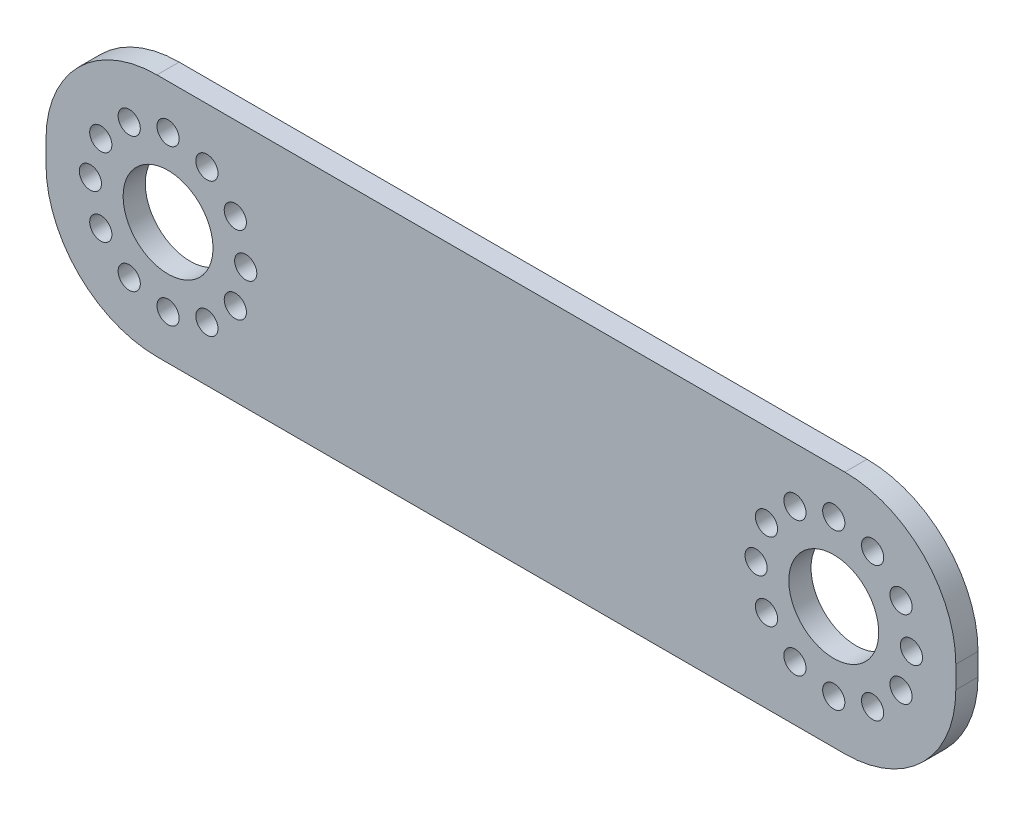
ISO-10303-21;
HEADER;
FILE_DESCRIPTION(('STEP AP214'),'2;1');
FILE_NAME('part.step','',(''),(''),'','','');
FILE_SCHEMA(('AUTOMOTIVE_DESIGN { 1 0 10303 214 1 1 1 1 }'));
ENDSEC;
DATA;
#1=APPLICATION_CONTEXT('core data for automotive mechanical design processes');
#2=APPLICATION_PROTOCOL_DEFINITION('international standard','automotive_design',2000,#1);
#3=PRODUCT_CONTEXT('',#1,'mechanical');
#4=PRODUCT('Part','Part','',(#3));
#5=PRODUCT_RELATED_PRODUCT_CATEGORY('part','',(#4));
#6=PRODUCT_DEFINITION_FORMATION('','',#4);
#7=PRODUCT_DEFINITION_CONTEXT('part definition',#1,'design');
#8=PRODUCT_DEFINITION('design','',#6,#7);
#9=PRODUCT_DEFINITION_SHAPE('','',#8);
#10=(LENGTH_UNIT() NAMED_UNIT(*) SI_UNIT(.MILLI.,.METRE.));
#11=(NAMED_UNIT(*) PLANE_ANGLE_UNIT() SI_UNIT($,.RADIAN.));
#12=(NAMED_UNIT(*) SI_UNIT($,.STERADIAN.) SOLID_ANGLE_UNIT());
#13=UNCERTAINTY_MEASURE_WITH_UNIT(LENGTH_MEASURE(1.E-05),#10,'distance_accuracy_value','');
#14=(GEOMETRIC_REPRESENTATION_CONTEXT(3) GLOBAL_UNCERTAINTY_ASSIGNED_CONTEXT((#13)) GLOBAL_UNIT_ASSIGNED_CONTEXT((#10,
#11,#12)) REPRESENTATION_CONTEXT('',''));
#15=CARTESIAN_POINT('',(0.,0.,0.));
#16=DIRECTION('',(0.,0.,1.));
#17=DIRECTION('',(1.,0.,0.));
#18=AXIS2_PLACEMENT_3D('',#15,#16,#17);
#19=CARTESIAN_POINT('',(82.,11.,2.));
#20=DIRECTION('',(1.,0.,0.));
#21=DIRECTION('',(0.,0.,-1.));
#22=AXIS2_PLACEMENT_3D('',#19,#20,#21);
#23=PLANE('',#22);
#24=DIRECTION('',(0.,-1.,0.));
#25=VECTOR('',#24,1.);
#26=CARTESIAN_POINT('',(82.,11.,0.));
#27=LINE('',#26,#25);
#28=CARTESIAN_POINT('',(82.,0.999999999999999,0.));
#29=VERTEX_POINT('',#28);
#30=CARTESIAN_POINT('',(82.,-0.999999999999999,0.));
#31=VERTEX_POINT('',#30);
#32=EDGE_CURVE('E160',#29,#31,#27,.T.);
#33=ORIENTED_EDGE('',*,*,#32,.F.);
#34=DIRECTION('',(0.,0.,-1.));
#35=VECTOR('',#34,1.);
#36=CARTESIAN_POINT('',(82.,0.999999999999999,2.));
#37=LINE('',#36,#35);
#38=CARTESIAN_POINT('',(82.,0.999999999999999,2.));
#39=VERTEX_POINT('',#38);
#40=EDGE_CURVE('E140',#29,#39,#37,.F.);
#41=ORIENTED_EDGE('',*,*,#40,.T.);
#42=DIRECTION('',(0.,-1.,0.));
#43=VECTOR('',#42,1.);
#44=CARTESIAN_POINT('',(82.,11.,2.));
#45=LINE('',#44,#43);
#46=CARTESIAN_POINT('',(82.,-0.999999999999999,2.));
#47=VERTEX_POINT('',#46);
#48=EDGE_CURVE('E121',#39,#47,#45,.T.);
#49=ORIENTED_EDGE('',*,*,#48,.T.);
#50=DIRECTION('',(0.,0.,-1.));
#51=VECTOR('',#50,1.);
#52=CARTESIAN_POINT('',(82.,-0.999999999999999,2.));
#53=LINE('',#52,#51);
#54=EDGE_CURVE('E137',#47,#31,#53,.T.);
#55=ORIENTED_EDGE('',*,*,#54,.T.);
#56=EDGE_LOOP('',(#33,#41,#49,#55));
#57=FACE_BOUND('',#56,.T.);
#58=ADVANCED_FACE('F35',(#57),#23,.T.);
#59=CARTESIAN_POINT('',(0.,11.,2.));
#60=DIRECTION('',(0.,1.,0.));
#61=DIRECTION('',(-1.,0.,0.));
#62=AXIS2_PLACEMENT_3D('',#59,#60,#61);
#63=PLANE('',#62);
#64=DIRECTION('',(1.,0.,0.));
#65=VECTOR('',#64,1.);
#66=CARTESIAN_POINT('',(0.,11.,2.));
#67=LINE('',#66,#65);
#68=CARTESIAN_POINT('',(10.,11.,2.));
#69=VERTEX_POINT('',#68);
#70=CARTESIAN_POINT('',(72.,11.,2.));
#71=VERTEX_POINT('',#70);
#72=EDGE_CURVE('E125',#69,#71,#67,.T.);
#73=ORIENTED_EDGE('',*,*,#72,.T.);
#74=DIRECTION('',(0.,0.,-1.));
#75=VECTOR('',#74,1.);
#76=CARTESIAN_POINT('',(72.,11.,2.));
#77=LINE('',#76,#75);
#78=CARTESIAN_POINT('',(72.,11.,0.));
#79=VERTEX_POINT('',#78);
#80=EDGE_CURVE('E112',#71,#79,#77,.T.);
#81=ORIENTED_EDGE('',*,*,#80,.T.);
#82=DIRECTION('',(1.,0.,0.));
#83=VECTOR('',#82,1.);
#84=CARTESIAN_POINT('',(0.,11.,0.));
#85=LINE('',#84,#83);
#86=CARTESIAN_POINT('',(10.,11.,0.));
#87=VERTEX_POINT('',#86);
#88=EDGE_CURVE('E104',#87,#79,#85,.T.);
#89=ORIENTED_EDGE('',*,*,#88,.F.);
#90=DIRECTION('',(0.,0.,-1.));
#91=VECTOR('',#90,1.);
#92=CARTESIAN_POINT('',(10.,11.,2.));
#93=LINE('',#92,#91);
#94=EDGE_CURVE('E118',#87,#69,#93,.F.);
#95=ORIENTED_EDGE('',*,*,#94,.T.);
#96=EDGE_LOOP('',(#73,#81,#89,#95));
#97=FACE_BOUND('',#96,.T.);
#98=ADVANCED_FACE('F117',(#97),#63,.T.);
#99=CARTESIAN_POINT('',(0.,-11.,2.));
#100=DIRECTION('',(-1.,0.,0.));
#101=DIRECTION('',(0.,-1.,0.));
#102=AXIS2_PLACEMENT_3D('',#99,#100,#101);
#103=PLANE('',#102);
#104=DIRECTION('',(0.,1.,0.));
#105=VECTOR('',#104,1.);
#106=CARTESIAN_POINT('',(0.,-11.,0.));
#107=LINE('',#106,#105);
#108=CARTESIAN_POINT('',(0.,-0.999999999999996,0.));
#109=VERTEX_POINT('',#108);
#110=CARTESIAN_POINT('',(0.,1.,0.));
#111=VERTEX_POINT('',#110);
#112=EDGE_CURVE('E106',#109,#111,#107,.T.);
#113=ORIENTED_EDGE('',*,*,#112,.F.);
#114=DIRECTION('',(0.,0.,-1.));
#115=VECTOR('',#114,1.);
#116=CARTESIAN_POINT('',(0.,-0.999999999999996,2.));
#117=LINE('',#116,#115);
#118=CARTESIAN_POINT('',(0.,-0.999999999999996,2.));
#119=VERTEX_POINT('',#118);
#120=EDGE_CURVE('E11',#109,#119,#117,.F.);
#121=ORIENTED_EDGE('',*,*,#120,.T.);
#122=DIRECTION('',(0.,1.,0.));
#123=VECTOR('',#122,1.);
#124=CARTESIAN_POINT('',(0.,-11.,2.));
#125=LINE('',#124,#123);
#126=CARTESIAN_POINT('',(0.,1.,2.));
#127=VERTEX_POINT('',#126);
#128=EDGE_CURVE('E128',#119,#127,#125,.T.);
#129=ORIENTED_EDGE('',*,*,#128,.T.);
#130=DIRECTION('',(0.,0.,-1.));
#131=VECTOR('',#130,1.);
#132=CARTESIAN_POINT('',(0.,1.,2.));
#133=LINE('',#132,#131);
#134=EDGE_CURVE('E43',#127,#111,#133,.T.);
#135=ORIENTED_EDGE('',*,*,#134,.T.);
#136=EDGE_LOOP('',(#113,#121,#129,#135));
#137=FACE_BOUND('',#136,.T.);
#138=ADVANCED_FACE('F153',(#137),#103,.T.);
#139=CARTESIAN_POINT('',(82.,-11.,2.));
#140=DIRECTION('',(0.,-1.,0.));
#141=DIRECTION('',(1.,0.,0.));
#142=AXIS2_PLACEMENT_3D('',#139,#140,#141);
#143=PLANE('',#142);
#144=DIRECTION('',(-1.,0.,0.));
#145=VECTOR('',#144,1.);
#146=CARTESIAN_POINT('',(82.,-11.,0.));
#147=LINE('',#146,#145);
#148=CARTESIAN_POINT('',(72.,-11.,0.));
#149=VERTEX_POINT('',#148);
#150=CARTESIAN_POINT('',(9.99999999999999,-11.,0.));
#151=VERTEX_POINT('',#150);
#152=EDGE_CURVE('E163',#149,#151,#147,.T.);
#153=ORIENTED_EDGE('',*,*,#152,.F.);
#154=DIRECTION('',(0.,0.,-1.));
#155=VECTOR('',#154,1.);
#156=CARTESIAN_POINT('',(72.,-11.,2.));
#157=LINE('',#156,#155);
#158=CARTESIAN_POINT('',(72.,-11.,2.));
#159=VERTEX_POINT('',#158);
#160=EDGE_CURVE('E57',#149,#159,#157,.F.);
#161=ORIENTED_EDGE('',*,*,#160,.T.);
#162=DIRECTION('',(-1.,0.,0.));
#163=VECTOR('',#162,1.);
#164=CARTESIAN_POINT('',(82.,-11.,2.));
#165=LINE('',#164,#163);
#166=CARTESIAN_POINT('',(9.99999999999999,-11.,2.));
#167=VERTEX_POINT('',#166);
#168=EDGE_CURVE('E155',#159,#167,#165,.T.);
#169=ORIENTED_EDGE('',*,*,#168,.T.);
#170=DIRECTION('',(0.,0.,-1.));
#171=VECTOR('',#170,1.);
#172=CARTESIAN_POINT('',(9.99999999999999,-11.,2.));
#173=LINE('',#172,#171);
#174=EDGE_CURVE('E148',#167,#151,#173,.T.);
#175=ORIENTED_EDGE('',*,*,#174,.T.);
#176=EDGE_LOOP('',(#153,#161,#169,#175));
#177=FACE_BOUND('',#176,.T.);
#178=ADVANCED_FACE('F166',(#177),#143,.T.);
#179=CARTESIAN_POINT('',(0.,0.,2.));
#180=DIRECTION('',(0.,0.,-1.));
#181=DIRECTION('',(-1.,0.,0.));
#182=AXIS2_PLACEMENT_3D('',#179,#180,#181);
#183=PLANE('',#182);
#184=CARTESIAN_POINT('',(64.9378221735089,3.5,2.));
#185=DIRECTION('',(0.,0.,-1.));
#186=DIRECTION('',(-1.,0.,0.));
#187=AXIS2_PLACEMENT_3D('',#184,#185,#186);
#188=CIRCLE('',#187,0.999999999999998);
#189=CARTESIAN_POINT('',(63.9378221735089,3.5,2.));
#190=VERTEX_POINT('',#189);
#191=EDGE_CURVE('E327',#190,#190,#188,.T.);
#192=ORIENTED_EDGE('',*,*,#191,.T.);
#193=EDGE_LOOP('',(#192));
#194=FACE_BOUND('',#193,.T.);
#195=CARTESIAN_POINT('',(67.5,6.06217782649107,2.));
#196=DIRECTION('',(0.,0.,-1.));
#197=DIRECTION('',(-1.,0.,0.));
#198=AXIS2_PLACEMENT_3D('',#195,#196,#197);
#199=CIRCLE('',#198,1.00000000000001);
#200=CARTESIAN_POINT('',(66.5,6.06217782649107,2.));
#201=VERTEX_POINT('',#200);
#202=EDGE_CURVE('E321',#201,#201,#199,.T.);
#203=ORIENTED_EDGE('',*,*,#202,.T.);
#204=EDGE_LOOP('',(#203));
#205=FACE_BOUND('',#204,.T.);
#206=CARTESIAN_POINT('',(71.,7.,2.));
#207=DIRECTION('',(0.,0.,-1.));
#208=DIRECTION('',(-1.,0.,0.));
#209=AXIS2_PLACEMENT_3D('',#206,#207,#208);
#210=CIRCLE('',#209,0.999999999999998);
#211=CARTESIAN_POINT('',(70.,7.,2.));
#212=VERTEX_POINT('',#211);
#213=EDGE_CURVE('E315',#212,#212,#210,.T.);
#214=ORIENTED_EDGE('',*,*,#213,.T.);
#215=EDGE_LOOP('',(#214));
#216=FACE_BOUND('',#215,.T.);
#217=CARTESIAN_POINT('',(74.5,6.06217782649107,2.));
#218=DIRECTION('',(0.,0.,-1.));
#219=DIRECTION('',(-1.,0.,0.));
#220=AXIS2_PLACEMENT_3D('',#217,#218,#219);
#221=CIRCLE('',#220,0.999999999999998);
#222=CARTESIAN_POINT('',(73.5,6.06217782649107,2.));
#223=VERTEX_POINT('',#222);
#224=EDGE_CURVE('E309',#223,#223,#221,.T.);
#225=ORIENTED_EDGE('',*,*,#224,.T.);
#226=EDGE_LOOP('',(#225));
#227=FACE_BOUND('',#226,.T.);
#228=CARTESIAN_POINT('',(77.0621778264911,3.5,2.));
#229=DIRECTION('',(0.,0.,-1.));
#230=DIRECTION('',(-1.,0.,0.));
#231=AXIS2_PLACEMENT_3D('',#228,#229,#230);
#232=CIRCLE('',#231,0.999999999999998);
#233=CARTESIAN_POINT('',(76.0621778264911,3.5,2.));
#234=VERTEX_POINT('',#233);
#235=EDGE_CURVE('E303',#234,#234,#232,.T.);
#236=ORIENTED_EDGE('',*,*,#235,.T.);
#237=EDGE_LOOP('',(#236));
#238=FACE_BOUND('',#237,.T.);
#239=CARTESIAN_POINT('',(78.,0.,2.));
#240=DIRECTION('',(0.,0.,-1.));
#241=DIRECTION('',(-1.,0.,0.));
#242=AXIS2_PLACEMENT_3D('',#239,#240,#241);
#243=CIRCLE('',#242,1.00000000000001);
#244=CARTESIAN_POINT('',(77.,0.,2.));
#245=VERTEX_POINT('',#244);
#246=EDGE_CURVE('E297',#245,#245,#243,.T.);
#247=ORIENTED_EDGE('',*,*,#246,.T.);
#248=EDGE_LOOP('',(#247));
#249=FACE_BOUND('',#248,.T.);
#250=CARTESIAN_POINT('',(77.0621778264911,-3.5,2.));
#251=DIRECTION('',(0.,0.,-1.));
#252=DIRECTION('',(-1.,0.,0.));
#253=AXIS2_PLACEMENT_3D('',#250,#251,#252);
#254=CIRCLE('',#253,0.999999999999998);
#255=CARTESIAN_POINT('',(76.0621778264911,-3.5,2.));
#256=VERTEX_POINT('',#255);
#257=EDGE_CURVE('E291',#256,#256,#254,.T.);
#258=ORIENTED_EDGE('',*,*,#257,.T.);
#259=EDGE_LOOP('',(#258));
#260=FACE_BOUND('',#259,.T.);
#261=CARTESIAN_POINT('',(74.5,-6.06217782649107,2.));
#262=DIRECTION('',(0.,0.,-1.));
#263=DIRECTION('',(-1.,0.,0.));
#264=AXIS2_PLACEMENT_3D('',#261,#262,#263);
#265=CIRCLE('',#264,1.00000000000001);
#266=CARTESIAN_POINT('',(73.5,-6.06217782649107,2.));
#267=VERTEX_POINT('',#266);
#268=EDGE_CURVE('E285',#267,#267,#265,.T.);
#269=ORIENTED_EDGE('',*,*,#268,.T.);
#270=EDGE_LOOP('',(#269));
#271=FACE_BOUND('',#270,.T.);
#272=CARTESIAN_POINT('',(71.,-7.,2.));
#273=DIRECTION('',(0.,0.,-1.));
#274=DIRECTION('',(-1.,0.,0.));
#275=AXIS2_PLACEMENT_3D('',#272,#273,#274);
#276=CIRCLE('',#275,0.999999999999998);
#277=CARTESIAN_POINT('',(70.,-7.,2.));
#278=VERTEX_POINT('',#277);
#279=EDGE_CURVE('E279',#278,#278,#276,.T.);
#280=ORIENTED_EDGE('',*,*,#279,.T.);
#281=EDGE_LOOP('',(#280));
#282=FACE_BOUND('',#281,.T.);
#283=CARTESIAN_POINT('',(67.5,-6.06217782649107,2.));
#284=DIRECTION('',(0.,0.,-1.));
#285=DIRECTION('',(-1.,0.,0.));
#286=AXIS2_PLACEMENT_3D('',#283,#284,#285);
#287=CIRCLE('',#286,0.999999999999998);
#288=CARTESIAN_POINT('',(66.5,-6.06217782649107,2.));
#289=VERTEX_POINT('',#288);
#290=EDGE_CURVE('E273',#289,#289,#287,.T.);
#291=ORIENTED_EDGE('',*,*,#290,.T.);
#292=EDGE_LOOP('',(#291));
#293=FACE_BOUND('',#292,.T.);
#294=CARTESIAN_POINT('',(64.9378221735089,-3.5,2.));
#295=DIRECTION('',(0.,0.,-1.));
#296=DIRECTION('',(-1.,0.,0.));
#297=AXIS2_PLACEMENT_3D('',#294,#295,#296);
#298=CIRCLE('',#297,0.999999999999998);
#299=CARTESIAN_POINT('',(63.9378221735089,-3.5,2.));
#300=VERTEX_POINT('',#299);
#301=EDGE_CURVE('E267',#300,#300,#298,.T.);
#302=ORIENTED_EDGE('',*,*,#301,.T.);
#303=EDGE_LOOP('',(#302));
#304=FACE_BOUND('',#303,.T.);
#305=CARTESIAN_POINT('',(64.,0.,2.));
#306=DIRECTION('',(0.,0.,-1.));
#307=DIRECTION('',(-1.,0.,0.));
#308=AXIS2_PLACEMENT_3D('',#305,#306,#307);
#309=CIRCLE('',#308,0.999999999999998);
#310=CARTESIAN_POINT('',(63.,0.,2.));
#311=VERTEX_POINT('',#310);
#312=EDGE_CURVE('E261',#311,#311,#309,.T.);
#313=ORIENTED_EDGE('',*,*,#312,.T.);
#314=EDGE_LOOP('',(#313));
#315=FACE_BOUND('',#314,.T.);
#316=CARTESIAN_POINT('',(71.,0.,2.));
#317=DIRECTION('',(0.,0.,-1.));
#318=DIRECTION('',(-1.,0.,0.));
#319=AXIS2_PLACEMENT_3D('',#316,#317,#318);
#320=CIRCLE('',#319,4.05);
#321=CARTESIAN_POINT('',(66.95,0.,2.));
#322=VERTEX_POINT('',#321);
#323=EDGE_CURVE('E255',#322,#322,#320,.T.);
#324=ORIENTED_EDGE('',*,*,#323,.T.);
#325=EDGE_LOOP('',(#324));
#326=FACE_BOUND('',#325,.T.);
#327=CARTESIAN_POINT('',(4.93782217350893,3.5,2.));
#328=DIRECTION('',(0.,0.,-1.));
#329=DIRECTION('',(-1.,0.,0.));
#330=AXIS2_PLACEMENT_3D('',#327,#328,#329);
#331=CIRCLE('',#330,1.);
#332=CARTESIAN_POINT('',(3.93782217350893,3.5,2.));
#333=VERTEX_POINT('',#332);
#334=EDGE_CURVE('E249',#333,#333,#331,.T.);
#335=ORIENTED_EDGE('',*,*,#334,.T.);
#336=EDGE_LOOP('',(#335));
#337=FACE_BOUND('',#336,.T.);
#338=CARTESIAN_POINT('',(7.5,6.06217782649107,2.));
#339=DIRECTION('',(0.,0.,-1.));
#340=DIRECTION('',(-1.,0.,0.));
#341=AXIS2_PLACEMENT_3D('',#338,#339,#340);
#342=CIRCLE('',#341,1.);
#343=CARTESIAN_POINT('',(6.5,6.06217782649107,2.));
#344=VERTEX_POINT('',#343);
#345=EDGE_CURVE('E243',#344,#344,#342,.T.);
#346=ORIENTED_EDGE('',*,*,#345,.T.);
#347=EDGE_LOOP('',(#346));
#348=FACE_BOUND('',#347,.T.);
#349=CARTESIAN_POINT('',(11.,7.,2.));
#350=DIRECTION('',(0.,0.,-1.));
#351=DIRECTION('',(-1.,0.,0.));
#352=AXIS2_PLACEMENT_3D('',#349,#350,#351);
#353=CIRCLE('',#352,1.);
#354=CARTESIAN_POINT('',(10.,7.,2.));
#355=VERTEX_POINT('',#354);
#356=EDGE_CURVE('E237',#355,#355,#353,.T.);
#357=ORIENTED_EDGE('',*,*,#356,.T.);
#358=EDGE_LOOP('',(#357));
#359=FACE_BOUND('',#358,.T.);
#360=CARTESIAN_POINT('',(14.5,6.06217782649107,2.));
#361=DIRECTION('',(0.,0.,-1.));
#362=DIRECTION('',(-1.,0.,0.));
#363=AXIS2_PLACEMENT_3D('',#360,#361,#362);
#364=CIRCLE('',#363,1.);
#365=CARTESIAN_POINT('',(13.5,6.06217782649107,2.));
#366=VERTEX_POINT('',#365);
#367=EDGE_CURVE('E231',#366,#366,#364,.T.);
#368=ORIENTED_EDGE('',*,*,#367,.T.);
#369=EDGE_LOOP('',(#368));
#370=FACE_BOUND('',#369,.T.);
#371=CARTESIAN_POINT('',(17.0621778264911,3.5,2.));
#372=DIRECTION('',(0.,0.,-1.));
#373=DIRECTION('',(-1.,0.,0.));
#374=AXIS2_PLACEMENT_3D('',#371,#372,#373);
#375=CIRCLE('',#374,1.);
#376=CARTESIAN_POINT('',(16.0621778264911,3.5,2.));
#377=VERTEX_POINT('',#376);
#378=EDGE_CURVE('E225',#377,#377,#375,.T.);
#379=ORIENTED_EDGE('',*,*,#378,.T.);
#380=EDGE_LOOP('',(#379));
#381=FACE_BOUND('',#380,.T.);
#382=CARTESIAN_POINT('',(18.,0.,2.));
#383=DIRECTION('',(0.,0.,-1.));
#384=DIRECTION('',(-1.,0.,0.));
#385=AXIS2_PLACEMENT_3D('',#382,#383,#384);
#386=CIRCLE('',#385,0.999999999999998);
#387=CARTESIAN_POINT('',(17.,0.,2.));
#388=VERTEX_POINT('',#387);
#389=EDGE_CURVE('E219',#388,#388,#386,.T.);
#390=ORIENTED_EDGE('',*,*,#389,.T.);
#391=EDGE_LOOP('',(#390));
#392=FACE_BOUND('',#391,.T.);
#393=CARTESIAN_POINT('',(17.0621778264911,-3.5,2.));
#394=DIRECTION('',(0.,0.,-1.));
#395=DIRECTION('',(-1.,0.,0.));
#396=AXIS2_PLACEMENT_3D('',#393,#394,#395);
#397=CIRCLE('',#396,0.999999999999998);
#398=CARTESIAN_POINT('',(16.0621778264911,-3.5,2.));
#399=VERTEX_POINT('',#398);
#400=EDGE_CURVE('E213',#399,#399,#397,.T.);
#401=ORIENTED_EDGE('',*,*,#400,.T.);
#402=EDGE_LOOP('',(#401));
#403=FACE_BOUND('',#402,.T.);
#404=CARTESIAN_POINT('',(14.5,-6.06217782649107,2.));
#405=DIRECTION('',(0.,0.,-1.));
#406=DIRECTION('',(-1.,0.,0.));
#407=AXIS2_PLACEMENT_3D('',#404,#405,#406);
#408=CIRCLE('',#407,1.);
#409=CARTESIAN_POINT('',(13.5,-6.06217782649107,2.));
#410=VERTEX_POINT('',#409);
#411=EDGE_CURVE('E207',#410,#410,#408,.T.);
#412=ORIENTED_EDGE('',*,*,#411,.T.);
#413=EDGE_LOOP('',(#412));
#414=FACE_BOUND('',#413,.T.);
#415=CARTESIAN_POINT('',(11.,-7.,2.));
#416=DIRECTION('',(0.,0.,-1.));
#417=DIRECTION('',(-1.,0.,0.));
#418=AXIS2_PLACEMENT_3D('',#415,#416,#417);
#419=CIRCLE('',#418,1.);
#420=CARTESIAN_POINT('',(10.,-7.,2.));
#421=VERTEX_POINT('',#420);
#422=EDGE_CURVE('E201',#421,#421,#419,.T.);
#423=ORIENTED_EDGE('',*,*,#422,.T.);
#424=EDGE_LOOP('',(#423));
#425=FACE_BOUND('',#424,.T.);
#426=CARTESIAN_POINT('',(7.5,-6.06217782649107,2.));
#427=DIRECTION('',(0.,0.,-1.));
#428=DIRECTION('',(-1.,0.,0.));
#429=AXIS2_PLACEMENT_3D('',#426,#427,#428);
#430=CIRCLE('',#429,1.);
#431=CARTESIAN_POINT('',(6.5,-6.06217782649107,2.));
#432=VERTEX_POINT('',#431);
#433=EDGE_CURVE('E195',#432,#432,#430,.T.);
#434=ORIENTED_EDGE('',*,*,#433,.T.);
#435=EDGE_LOOP('',(#434));
#436=FACE_BOUND('',#435,.T.);
#437=CARTESIAN_POINT('',(4.93782217350893,-3.5,2.));
#438=DIRECTION('',(0.,0.,-1.));
#439=DIRECTION('',(-1.,0.,0.));
#440=AXIS2_PLACEMENT_3D('',#437,#438,#439);
#441=CIRCLE('',#440,1.);
#442=CARTESIAN_POINT('',(3.93782217350893,-3.5,2.));
#443=VERTEX_POINT('',#442);
#444=EDGE_CURVE('E189',#443,#443,#441,.T.);
#445=ORIENTED_EDGE('',*,*,#444,.T.);
#446=EDGE_LOOP('',(#445));
#447=FACE_BOUND('',#446,.T.);
#448=CARTESIAN_POINT('',(4.,0.,2.));
#449=DIRECTION('',(0.,0.,-1.));
#450=DIRECTION('',(-1.,0.,0.));
#451=AXIS2_PLACEMENT_3D('',#448,#449,#450);
#452=CIRCLE('',#451,1.);
#453=CARTESIAN_POINT('',(3.,0.,2.));
#454=VERTEX_POINT('',#453);
#455=EDGE_CURVE('E183',#454,#454,#452,.T.);
#456=ORIENTED_EDGE('',*,*,#455,.T.);
#457=EDGE_LOOP('',(#456));
#458=FACE_BOUND('',#457,.T.);
#459=CARTESIAN_POINT('',(11.,0.,2.));
#460=DIRECTION('',(0.,0.,-1.));
#461=DIRECTION('',(-1.,0.,0.));
#462=AXIS2_PLACEMENT_3D('',#459,#460,#461);
#463=CIRCLE('',#462,4.05);
#464=CARTESIAN_POINT('',(6.95,0.,2.));
#465=VERTEX_POINT('',#464);
#466=EDGE_CURVE('E164',#465,#465,#463,.T.);
#467=ORIENTED_EDGE('',*,*,#466,.T.);
#468=EDGE_LOOP('',(#467));
#469=FACE_BOUND('',#468,.T.);
#470=ORIENTED_EDGE('',*,*,#48,.F.);
#471=CARTESIAN_POINT('',(72.,0.999999999999999,2.));
#472=DIRECTION('',(0.,0.,-1.));
#473=DIRECTION('',(-1.,0.,0.));
#474=AXIS2_PLACEMENT_3D('',#471,#472,#473);
#475=CIRCLE('',#474,10.);
#476=EDGE_CURVE('E146',#39,#71,#475,.F.);
#477=ORIENTED_EDGE('',*,*,#476,.T.);
#478=ORIENTED_EDGE('',*,*,#72,.F.);
#479=CARTESIAN_POINT('',(10.,1.,2.));
#480=DIRECTION('',(0.,0.,-1.));
#481=DIRECTION('',(-1.,0.,0.));
#482=AXIS2_PLACEMENT_3D('',#479,#480,#481);
#483=CIRCLE('',#482,10.);
#484=EDGE_CURVE('E124',#69,#127,#483,.F.);
#485=ORIENTED_EDGE('',*,*,#484,.T.);
#486=ORIENTED_EDGE('',*,*,#128,.F.);
#487=CARTESIAN_POINT('',(9.99999999999999,-0.999999999999998,2.));
#488=DIRECTION('',(0.,0.,-1.));
#489=DIRECTION('',(-1.,0.,0.));
#490=AXIS2_PLACEMENT_3D('',#487,#488,#489);
#491=CIRCLE('',#490,10.);
#492=EDGE_CURVE('E50',#119,#167,#491,.F.);
#493=ORIENTED_EDGE('',*,*,#492,.T.);
#494=ORIENTED_EDGE('',*,*,#168,.F.);
#495=CARTESIAN_POINT('',(72.,-0.999999999999999,2.));
#496=DIRECTION('',(0.,0.,-1.));
#497=DIRECTION('',(-1.,0.,0.));
#498=AXIS2_PLACEMENT_3D('',#495,#496,#497);
#499=CIRCLE('',#498,10.);
#500=EDGE_CURVE('E144',#159,#47,#499,.F.);
#501=ORIENTED_EDGE('',*,*,#500,.T.);
#502=EDGE_LOOP('',(#470,#477,#478,#485,#486,#493,#494,#501));
#503=FACE_BOUND('',#502,.T.);
#504=ADVANCED_FACE('F174',(#194,#205,#216,#227,#238,#249,#260,#271,#282,#293,#304,#315,#326,
#337,#348,#359,#370,#381,#392,#403,#414,#425,#436,#447,#458,#469,#503),#183,.F.);
#505=CARTESIAN_POINT('',(0.,0.,0.));
#506=DIRECTION('',(0.,0.,-1.));
#507=DIRECTION('',(-1.,0.,0.));
#508=AXIS2_PLACEMENT_3D('',#505,#506,#507);
#509=PLANE('',#508);
#510=CARTESIAN_POINT('',(64.9378221735089,3.5,0.));
#511=DIRECTION('',(0.,0.,-1.));
#512=DIRECTION('',(-1.,0.,0.));
#513=AXIS2_PLACEMENT_3D('',#510,#511,#512);
#514=CIRCLE('',#513,0.999999999999998);
#515=CARTESIAN_POINT('',(63.9378221735089,3.5,0.));
#516=VERTEX_POINT('',#515);
#517=EDGE_CURVE('E330',#516,#516,#514,.T.);
#518=ORIENTED_EDGE('',*,*,#517,.F.);
#519=EDGE_LOOP('',(#518));
#520=FACE_BOUND('',#519,.T.);
#521=CARTESIAN_POINT('',(67.5,6.06217782649107,0.));
#522=DIRECTION('',(0.,0.,-1.));
#523=DIRECTION('',(-1.,0.,0.));
#524=AXIS2_PLACEMENT_3D('',#521,#522,#523);
#525=CIRCLE('',#524,1.00000000000001);
#526=CARTESIAN_POINT('',(66.5,6.06217782649107,0.));
#527=VERTEX_POINT('',#526);
#528=EDGE_CURVE('E324',#527,#527,#525,.T.);
#529=ORIENTED_EDGE('',*,*,#528,.F.);
#530=EDGE_LOOP('',(#529));
#531=FACE_BOUND('',#530,.T.);
#532=CARTESIAN_POINT('',(71.,7.,0.));
#533=DIRECTION('',(0.,0.,-1.));
#534=DIRECTION('',(-1.,0.,0.));
#535=AXIS2_PLACEMENT_3D('',#532,#533,#534);
#536=CIRCLE('',#535,0.999999999999998);
#537=CARTESIAN_POINT('',(70.,7.,0.));
#538=VERTEX_POINT('',#537);
#539=EDGE_CURVE('E318',#538,#538,#536,.T.);
#540=ORIENTED_EDGE('',*,*,#539,.F.);
#541=EDGE_LOOP('',(#540));
#542=FACE_BOUND('',#541,.T.);
#543=CARTESIAN_POINT('',(74.5,6.06217782649107,0.));
#544=DIRECTION('',(0.,0.,-1.));
#545=DIRECTION('',(-1.,0.,0.));
#546=AXIS2_PLACEMENT_3D('',#543,#544,#545);
#547=CIRCLE('',#546,0.999999999999998);
#548=CARTESIAN_POINT('',(73.5,6.06217782649107,0.));
#549=VERTEX_POINT('',#548);
#550=EDGE_CURVE('E312',#549,#549,#547,.T.);
#551=ORIENTED_EDGE('',*,*,#550,.F.);
#552=EDGE_LOOP('',(#551));
#553=FACE_BOUND('',#552,.T.);
#554=CARTESIAN_POINT('',(77.0621778264911,3.5,0.));
#555=DIRECTION('',(0.,0.,-1.));
#556=DIRECTION('',(-1.,0.,0.));
#557=AXIS2_PLACEMENT_3D('',#554,#555,#556);
#558=CIRCLE('',#557,0.999999999999998);
#559=CARTESIAN_POINT('',(76.0621778264911,3.5,0.));
#560=VERTEX_POINT('',#559);
#561=EDGE_CURVE('E306',#560,#560,#558,.T.);
#562=ORIENTED_EDGE('',*,*,#561,.F.);
#563=EDGE_LOOP('',(#562));
#564=FACE_BOUND('',#563,.T.);
#565=CARTESIAN_POINT('',(78.,0.,0.));
#566=DIRECTION('',(0.,0.,-1.));
#567=DIRECTION('',(-1.,0.,0.));
#568=AXIS2_PLACEMENT_3D('',#565,#566,#567);
#569=CIRCLE('',#568,1.00000000000001);
#570=CARTESIAN_POINT('',(77.,0.,0.));
#571=VERTEX_POINT('',#570);
#572=EDGE_CURVE('E300',#571,#571,#569,.T.);
#573=ORIENTED_EDGE('',*,*,#572,.F.);
#574=EDGE_LOOP('',(#573));
#575=FACE_BOUND('',#574,.T.);
#576=CARTESIAN_POINT('',(77.0621778264911,-3.5,0.));
#577=DIRECTION('',(0.,0.,-1.));
#578=DIRECTION('',(-1.,0.,0.));
#579=AXIS2_PLACEMENT_3D('',#576,#577,#578);
#580=CIRCLE('',#579,0.999999999999998);
#581=CARTESIAN_POINT('',(76.0621778264911,-3.5,0.));
#582=VERTEX_POINT('',#581);
#583=EDGE_CURVE('E294',#582,#582,#580,.T.);
#584=ORIENTED_EDGE('',*,*,#583,.F.);
#585=EDGE_LOOP('',(#584));
#586=FACE_BOUND('',#585,.T.);
#587=CARTESIAN_POINT('',(74.5,-6.06217782649107,0.));
#588=DIRECTION('',(0.,0.,-1.));
#589=DIRECTION('',(-1.,0.,0.));
#590=AXIS2_PLACEMENT_3D('',#587,#588,#589);
#591=CIRCLE('',#590,1.00000000000001);
#592=CARTESIAN_POINT('',(73.5,-6.06217782649107,0.));
#593=VERTEX_POINT('',#592);
#594=EDGE_CURVE('E288',#593,#593,#591,.T.);
#595=ORIENTED_EDGE('',*,*,#594,.F.);
#596=EDGE_LOOP('',(#595));
#597=FACE_BOUND('',#596,.T.);
#598=CARTESIAN_POINT('',(71.,-7.,0.));
#599=DIRECTION('',(0.,0.,-1.));
#600=DIRECTION('',(-1.,0.,0.));
#601=AXIS2_PLACEMENT_3D('',#598,#599,#600);
#602=CIRCLE('',#601,0.999999999999998);
#603=CARTESIAN_POINT('',(70.,-7.,0.));
#604=VERTEX_POINT('',#603);
#605=EDGE_CURVE('E282',#604,#604,#602,.T.);
#606=ORIENTED_EDGE('',*,*,#605,.F.);
#607=EDGE_LOOP('',(#606));
#608=FACE_BOUND('',#607,.T.);
#609=CARTESIAN_POINT('',(67.5,-6.06217782649107,0.));
#610=DIRECTION('',(0.,0.,-1.));
#611=DIRECTION('',(-1.,0.,0.));
#612=AXIS2_PLACEMENT_3D('',#609,#610,#611);
#613=CIRCLE('',#612,0.999999999999998);
#614=CARTESIAN_POINT('',(66.5,-6.06217782649107,0.));
#615=VERTEX_POINT('',#614);
#616=EDGE_CURVE('E276',#615,#615,#613,.T.);
#617=ORIENTED_EDGE('',*,*,#616,.F.);
#618=EDGE_LOOP('',(#617));
#619=FACE_BOUND('',#618,.T.);
#620=CARTESIAN_POINT('',(64.9378221735089,-3.5,0.));
#621=DIRECTION('',(0.,0.,-1.));
#622=DIRECTION('',(-1.,0.,0.));
#623=AXIS2_PLACEMENT_3D('',#620,#621,#622);
#624=CIRCLE('',#623,0.999999999999998);
#625=CARTESIAN_POINT('',(63.9378221735089,-3.5,0.));
#626=VERTEX_POINT('',#625);
#627=EDGE_CURVE('E270',#626,#626,#624,.T.);
#628=ORIENTED_EDGE('',*,*,#627,.F.);
#629=EDGE_LOOP('',(#628));
#630=FACE_BOUND('',#629,.T.);
#631=CARTESIAN_POINT('',(64.,0.,0.));
#632=DIRECTION('',(0.,0.,-1.));
#633=DIRECTION('',(-1.,0.,0.));
#634=AXIS2_PLACEMENT_3D('',#631,#632,#633);
#635=CIRCLE('',#634,0.999999999999998);
#636=CARTESIAN_POINT('',(63.,0.,0.));
#637=VERTEX_POINT('',#636);
#638=EDGE_CURVE('E264',#637,#637,#635,.T.);
#639=ORIENTED_EDGE('',*,*,#638,.F.);
#640=EDGE_LOOP('',(#639));
#641=FACE_BOUND('',#640,.T.);
#642=CARTESIAN_POINT('',(71.,0.,0.));
#643=DIRECTION('',(0.,0.,-1.));
#644=DIRECTION('',(-1.,0.,0.));
#645=AXIS2_PLACEMENT_3D('',#642,#643,#644);
#646=CIRCLE('',#645,4.05);
#647=CARTESIAN_POINT('',(66.95,0.,0.));
#648=VERTEX_POINT('',#647);
#649=EDGE_CURVE('E258',#648,#648,#646,.T.);
#650=ORIENTED_EDGE('',*,*,#649,.F.);
#651=EDGE_LOOP('',(#650));
#652=FACE_BOUND('',#651,.T.);
#653=CARTESIAN_POINT('',(4.93782217350893,3.5,0.));
#654=DIRECTION('',(0.,0.,-1.));
#655=DIRECTION('',(-1.,0.,0.));
#656=AXIS2_PLACEMENT_3D('',#653,#654,#655);
#657=CIRCLE('',#656,1.);
#658=CARTESIAN_POINT('',(3.93782217350893,3.5,0.));
#659=VERTEX_POINT('',#658);
#660=EDGE_CURVE('E252',#659,#659,#657,.T.);
#661=ORIENTED_EDGE('',*,*,#660,.F.);
#662=EDGE_LOOP('',(#661));
#663=FACE_BOUND('',#662,.T.);
#664=CARTESIAN_POINT('',(7.5,6.06217782649107,0.));
#665=DIRECTION('',(0.,0.,-1.));
#666=DIRECTION('',(-1.,0.,0.));
#667=AXIS2_PLACEMENT_3D('',#664,#665,#666);
#668=CIRCLE('',#667,1.);
#669=CARTESIAN_POINT('',(6.5,6.06217782649107,0.));
#670=VERTEX_POINT('',#669);
#671=EDGE_CURVE('E246',#670,#670,#668,.T.);
#672=ORIENTED_EDGE('',*,*,#671,.F.);
#673=EDGE_LOOP('',(#672));
#674=FACE_BOUND('',#673,.T.);
#675=CARTESIAN_POINT('',(11.,7.,0.));
#676=DIRECTION('',(0.,0.,-1.));
#677=DIRECTION('',(-1.,0.,0.));
#678=AXIS2_PLACEMENT_3D('',#675,#676,#677);
#679=CIRCLE('',#678,1.);
#680=CARTESIAN_POINT('',(10.,7.,0.));
#681=VERTEX_POINT('',#680);
#682=EDGE_CURVE('E240',#681,#681,#679,.T.);
#683=ORIENTED_EDGE('',*,*,#682,.F.);
#684=EDGE_LOOP('',(#683));
#685=FACE_BOUND('',#684,.T.);
#686=CARTESIAN_POINT('',(14.5,6.06217782649107,0.));
#687=DIRECTION('',(0.,0.,-1.));
#688=DIRECTION('',(-1.,0.,0.));
#689=AXIS2_PLACEMENT_3D('',#686,#687,#688);
#690=CIRCLE('',#689,1.);
#691=CARTESIAN_POINT('',(13.5,6.06217782649107,0.));
#692=VERTEX_POINT('',#691);
#693=EDGE_CURVE('E234',#692,#692,#690,.T.);
#694=ORIENTED_EDGE('',*,*,#693,.F.);
#695=EDGE_LOOP('',(#694));
#696=FACE_BOUND('',#695,.T.);
#697=CARTESIAN_POINT('',(17.0621778264911,3.5,0.));
#698=DIRECTION('',(0.,0.,-1.));
#699=DIRECTION('',(-1.,0.,0.));
#700=AXIS2_PLACEMENT_3D('',#697,#698,#699);
#701=CIRCLE('',#700,1.);
#702=CARTESIAN_POINT('',(16.0621778264911,3.5,0.));
#703=VERTEX_POINT('',#702);
#704=EDGE_CURVE('E228',#703,#703,#701,.T.);
#705=ORIENTED_EDGE('',*,*,#704,.F.);
#706=EDGE_LOOP('',(#705));
#707=FACE_BOUND('',#706,.T.);
#708=CARTESIAN_POINT('',(18.,0.,0.));
#709=DIRECTION('',(0.,0.,-1.));
#710=DIRECTION('',(-1.,0.,0.));
#711=AXIS2_PLACEMENT_3D('',#708,#709,#710);
#712=CIRCLE('',#711,0.999999999999998);
#713=CARTESIAN_POINT('',(17.,0.,0.));
#714=VERTEX_POINT('',#713);
#715=EDGE_CURVE('E222',#714,#714,#712,.T.);
#716=ORIENTED_EDGE('',*,*,#715,.F.);
#717=EDGE_LOOP('',(#716));
#718=FACE_BOUND('',#717,.T.);
#719=CARTESIAN_POINT('',(17.0621778264911,-3.5,0.));
#720=DIRECTION('',(0.,0.,-1.));
#721=DIRECTION('',(-1.,0.,0.));
#722=AXIS2_PLACEMENT_3D('',#719,#720,#721);
#723=CIRCLE('',#722,0.999999999999998);
#724=CARTESIAN_POINT('',(16.0621778264911,-3.5,0.));
#725=VERTEX_POINT('',#724);
#726=EDGE_CURVE('E216',#725,#725,#723,.T.);
#727=ORIENTED_EDGE('',*,*,#726,.F.);
#728=EDGE_LOOP('',(#727));
#729=FACE_BOUND('',#728,.T.);
#730=CARTESIAN_POINT('',(14.5,-6.06217782649107,0.));
#731=DIRECTION('',(0.,0.,-1.));
#732=DIRECTION('',(-1.,0.,0.));
#733=AXIS2_PLACEMENT_3D('',#730,#731,#732);
#734=CIRCLE('',#733,1.);
#735=CARTESIAN_POINT('',(13.5,-6.06217782649107,0.));
#736=VERTEX_POINT('',#735);
#737=EDGE_CURVE('E210',#736,#736,#734,.T.);
#738=ORIENTED_EDGE('',*,*,#737,.F.);
#739=EDGE_LOOP('',(#738));
#740=FACE_BOUND('',#739,.T.);
#741=CARTESIAN_POINT('',(11.,-7.,0.));
#742=DIRECTION('',(0.,0.,-1.));
#743=DIRECTION('',(-1.,0.,0.));
#744=AXIS2_PLACEMENT_3D('',#741,#742,#743);
#745=CIRCLE('',#744,1.);
#746=CARTESIAN_POINT('',(10.,-7.,0.));
#747=VERTEX_POINT('',#746);
#748=EDGE_CURVE('E204',#747,#747,#745,.T.);
#749=ORIENTED_EDGE('',*,*,#748,.F.);
#750=EDGE_LOOP('',(#749));
#751=FACE_BOUND('',#750,.T.);
#752=CARTESIAN_POINT('',(7.5,-6.06217782649107,0.));
#753=DIRECTION('',(0.,0.,-1.));
#754=DIRECTION('',(-1.,0.,0.));
#755=AXIS2_PLACEMENT_3D('',#752,#753,#754);
#756=CIRCLE('',#755,1.);
#757=CARTESIAN_POINT('',(6.5,-6.06217782649107,0.));
#758=VERTEX_POINT('',#757);
#759=EDGE_CURVE('E198',#758,#758,#756,.T.);
#760=ORIENTED_EDGE('',*,*,#759,.F.);
#761=EDGE_LOOP('',(#760));
#762=FACE_BOUND('',#761,.T.);
#763=CARTESIAN_POINT('',(4.93782217350893,-3.5,0.));
#764=DIRECTION('',(0.,0.,-1.));
#765=DIRECTION('',(-1.,0.,0.));
#766=AXIS2_PLACEMENT_3D('',#763,#764,#765);
#767=CIRCLE('',#766,1.);
#768=CARTESIAN_POINT('',(3.93782217350893,-3.5,0.));
#769=VERTEX_POINT('',#768);
#770=EDGE_CURVE('E192',#769,#769,#767,.T.);
#771=ORIENTED_EDGE('',*,*,#770,.F.);
#772=EDGE_LOOP('',(#771));
#773=FACE_BOUND('',#772,.T.);
#774=CARTESIAN_POINT('',(4.,0.,0.));
#775=DIRECTION('',(0.,0.,-1.));
#776=DIRECTION('',(-1.,0.,0.));
#777=AXIS2_PLACEMENT_3D('',#774,#775,#776);
#778=CIRCLE('',#777,1.);
#779=CARTESIAN_POINT('',(3.,0.,0.));
#780=VERTEX_POINT('',#779);
#781=EDGE_CURVE('E186',#780,#780,#778,.T.);
#782=ORIENTED_EDGE('',*,*,#781,.F.);
#783=EDGE_LOOP('',(#782));
#784=FACE_BOUND('',#783,.T.);
#785=CARTESIAN_POINT('',(11.,0.,0.));
#786=DIRECTION('',(0.,0.,-1.));
#787=DIRECTION('',(-1.,0.,0.));
#788=AXIS2_PLACEMENT_3D('',#785,#786,#787);
#789=CIRCLE('',#788,4.05);
#790=CARTESIAN_POINT('',(6.95,0.,0.));
#791=VERTEX_POINT('',#790);
#792=EDGE_CURVE('E180',#791,#791,#789,.T.);
#793=ORIENTED_EDGE('',*,*,#792,.F.);
#794=EDGE_LOOP('',(#793));
#795=FACE_BOUND('',#794,.T.);
#796=ORIENTED_EDGE('',*,*,#88,.T.);
#797=CARTESIAN_POINT('',(72.,0.999999999999999,0.));
#798=DIRECTION('',(0.,0.,-1.));
#799=DIRECTION('',(-1.,0.,0.));
#800=AXIS2_PLACEMENT_3D('',#797,#798,#799);
#801=CIRCLE('',#800,10.);
#802=EDGE_CURVE('E135',#79,#29,#801,.T.);
#803=ORIENTED_EDGE('',*,*,#802,.T.);
#804=ORIENTED_EDGE('',*,*,#32,.T.);
#805=CARTESIAN_POINT('',(72.,-0.999999999999999,0.));
#806=DIRECTION('',(0.,0.,-1.));
#807=DIRECTION('',(-1.,0.,0.));
#808=AXIS2_PLACEMENT_3D('',#805,#806,#807);
#809=CIRCLE('',#808,10.);
#810=EDGE_CURVE('E133',#31,#149,#809,.T.);
#811=ORIENTED_EDGE('',*,*,#810,.T.);
#812=ORIENTED_EDGE('',*,*,#152,.T.);
#813=CARTESIAN_POINT('',(9.99999999999999,-0.999999999999998,0.));
#814=DIRECTION('',(0.,0.,-1.));
#815=DIRECTION('',(-1.,0.,0.));
#816=AXIS2_PLACEMENT_3D('',#813,#814,#815);
#817=CIRCLE('',#816,10.);
#818=EDGE_CURVE('E111',#151,#109,#817,.T.);
#819=ORIENTED_EDGE('',*,*,#818,.T.);
#820=ORIENTED_EDGE('',*,*,#112,.T.);
#821=CARTESIAN_POINT('',(10.,1.,0.));
#822=DIRECTION('',(0.,0.,-1.));
#823=DIRECTION('',(-1.,0.,0.));
#824=AXIS2_PLACEMENT_3D('',#821,#822,#823);
#825=CIRCLE('',#824,10.);
#826=EDGE_CURVE('E101',#111,#87,#825,.T.);
#827=ORIENTED_EDGE('',*,*,#826,.T.);
#828=EDGE_LOOP('',(#796,#803,#804,#811,#812,#819,#820,#827));
#829=FACE_BOUND('',#828,.T.);
#830=ADVANCED_FACE('F103',(#520,#531,#542,#553,#564,#575,#586,#597,#608,#619,#630,#641,#652,
#663,#674,#685,#696,#707,#718,#729,#740,#751,#762,#773,#784,#795,#829),#509,.T.);
#831=CARTESIAN_POINT('',(11.,0.,2.));
#832=DIRECTION('',(0.,0.,-1.));
#833=DIRECTION('',(-1.,0.,0.));
#834=AXIS2_PLACEMENT_3D('',#831,#832,#833);
#835=CYLINDRICAL_SURFACE('',#834,4.05);
#836=ORIENTED_EDGE('',*,*,#466,.F.);
#837=EDGE_LOOP('',(#836));
#838=FACE_BOUND('',#837,.T.);
#839=ORIENTED_EDGE('',*,*,#792,.T.);
#840=EDGE_LOOP('',(#839));
#841=FACE_BOUND('',#840,.T.);
#842=ADVANCED_FACE('F348',(#838,#841),#835,.F.);
#843=CARTESIAN_POINT('',(4.,0.,2.));
#844=DIRECTION('',(0.,0.,-1.));
#845=DIRECTION('',(-1.,0.,0.));
#846=AXIS2_PLACEMENT_3D('',#843,#844,#845);
#847=CYLINDRICAL_SURFACE('',#846,1.);
#848=ORIENTED_EDGE('',*,*,#455,.F.);
#849=EDGE_LOOP('',(#848));
#850=FACE_BOUND('',#849,.T.);
#851=ORIENTED_EDGE('',*,*,#781,.T.);
#852=EDGE_LOOP('',(#851));
#853=FACE_BOUND('',#852,.T.);
#854=ADVANCED_FACE('F401',(#850,#853),#847,.F.);
#855=CARTESIAN_POINT('',(4.93782217350893,-3.5,2.));
#856=DIRECTION('',(0.,0.,-1.));
#857=DIRECTION('',(-1.,0.,0.));
#858=AXIS2_PLACEMENT_3D('',#855,#856,#857);
#859=CYLINDRICAL_SURFACE('',#858,1.);
#860=ORIENTED_EDGE('',*,*,#444,.F.);
#861=EDGE_LOOP('',(#860));
#862=FACE_BOUND('',#861,.T.);
#863=ORIENTED_EDGE('',*,*,#770,.T.);
#864=EDGE_LOOP('',(#863));
#865=FACE_BOUND('',#864,.T.);
#866=ADVANCED_FACE('F407',(#862,#865),#859,.F.);
#867=CARTESIAN_POINT('',(7.5,-6.06217782649107,2.));
#868=DIRECTION('',(0.,0.,-1.));
#869=DIRECTION('',(-1.,0.,0.));
#870=AXIS2_PLACEMENT_3D('',#867,#868,#869);
#871=CYLINDRICAL_SURFACE('',#870,1.);
#872=ORIENTED_EDGE('',*,*,#433,.F.);
#873=EDGE_LOOP('',(#872));
#874=FACE_BOUND('',#873,.T.);
#875=ORIENTED_EDGE('',*,*,#759,.T.);
#876=EDGE_LOOP('',(#875));
#877=FACE_BOUND('',#876,.T.);
#878=ADVANCED_FACE('F702',(#874,#877),#871,.F.);
#879=CARTESIAN_POINT('',(11.,-7.,2.));
#880=DIRECTION('',(0.,0.,-1.));
#881=DIRECTION('',(-1.,0.,0.));
#882=AXIS2_PLACEMENT_3D('',#879,#880,#881);
#883=CYLINDRICAL_SURFACE('',#882,1.);
#884=ORIENTED_EDGE('',*,*,#422,.F.);
#885=EDGE_LOOP('',(#884));
#886=FACE_BOUND('',#885,.T.);
#887=ORIENTED_EDGE('',*,*,#748,.T.);
#888=EDGE_LOOP('',(#887));
#889=FACE_BOUND('',#888,.T.);
#890=ADVANCED_FACE('F692',(#886,#889),#883,.F.);
#891=CARTESIAN_POINT('',(14.5,-6.06217782649107,2.));
#892=DIRECTION('',(0.,0.,-1.));
#893=DIRECTION('',(-1.,0.,0.));
#894=AXIS2_PLACEMENT_3D('',#891,#892,#893);
#895=CYLINDRICAL_SURFACE('',#894,1.);
#896=ORIENTED_EDGE('',*,*,#411,.F.);
#897=EDGE_LOOP('',(#896));
#898=FACE_BOUND('',#897,.T.);
#899=ORIENTED_EDGE('',*,*,#737,.T.);
#900=EDGE_LOOP('',(#899));
#901=FACE_BOUND('',#900,.T.);
#902=ADVANCED_FACE('F682',(#898,#901),#895,.F.);
#903=CARTESIAN_POINT('',(17.0621778264911,-3.5,2.));
#904=DIRECTION('',(0.,0.,-1.));
#905=DIRECTION('',(-1.,0.,0.));
#906=AXIS2_PLACEMENT_3D('',#903,#904,#905);
#907=CYLINDRICAL_SURFACE('',#906,0.999999999999998);
#908=ORIENTED_EDGE('',*,*,#400,.F.);
#909=EDGE_LOOP('',(#908));
#910=FACE_BOUND('',#909,.T.);
#911=ORIENTED_EDGE('',*,*,#726,.T.);
#912=EDGE_LOOP('',(#911));
#913=FACE_BOUND('',#912,.T.);
#914=ADVANCED_FACE('F672',(#910,#913),#907,.F.);
#915=CARTESIAN_POINT('',(18.,0.,2.));
#916=DIRECTION('',(0.,0.,-1.));
#917=DIRECTION('',(-1.,0.,0.));
#918=AXIS2_PLACEMENT_3D('',#915,#916,#917);
#919=CYLINDRICAL_SURFACE('',#918,0.999999999999998);
#920=ORIENTED_EDGE('',*,*,#389,.F.);
#921=EDGE_LOOP('',(#920));
#922=FACE_BOUND('',#921,.T.);
#923=ORIENTED_EDGE('',*,*,#715,.T.);
#924=EDGE_LOOP('',(#923));
#925=FACE_BOUND('',#924,.T.);
#926=ADVANCED_FACE('F662',(#922,#925),#919,.F.);
#927=CARTESIAN_POINT('',(17.0621778264911,3.5,2.));
#928=DIRECTION('',(0.,0.,-1.));
#929=DIRECTION('',(-1.,0.,0.));
#930=AXIS2_PLACEMENT_3D('',#927,#928,#929);
#931=CYLINDRICAL_SURFACE('',#930,1.);
#932=ORIENTED_EDGE('',*,*,#378,.F.);
#933=EDGE_LOOP('',(#932));
#934=FACE_BOUND('',#933,.T.);
#935=ORIENTED_EDGE('',*,*,#704,.T.);
#936=EDGE_LOOP('',(#935));
#937=FACE_BOUND('',#936,.T.);
#938=ADVANCED_FACE('F652',(#934,#937),#931,.F.);
#939=CARTESIAN_POINT('',(14.5,6.06217782649107,2.));
#940=DIRECTION('',(0.,0.,-1.));
#941=DIRECTION('',(-1.,0.,0.));
#942=AXIS2_PLACEMENT_3D('',#939,#940,#941);
#943=CYLINDRICAL_SURFACE('',#942,1.);
#944=ORIENTED_EDGE('',*,*,#367,.F.);
#945=EDGE_LOOP('',(#944));
#946=FACE_BOUND('',#945,.T.);
#947=ORIENTED_EDGE('',*,*,#693,.T.);
#948=EDGE_LOOP('',(#947));
#949=FACE_BOUND('',#948,.T.);
#950=ADVANCED_FACE('F642',(#946,#949),#943,.F.);
#951=CARTESIAN_POINT('',(11.,7.,2.));
#952=DIRECTION('',(0.,0.,-1.));
#953=DIRECTION('',(-1.,0.,0.));
#954=AXIS2_PLACEMENT_3D('',#951,#952,#953);
#955=CYLINDRICAL_SURFACE('',#954,1.);
#956=ORIENTED_EDGE('',*,*,#356,.F.);
#957=EDGE_LOOP('',(#956));
#958=FACE_BOUND('',#957,.T.);
#959=ORIENTED_EDGE('',*,*,#682,.T.);
#960=EDGE_LOOP('',(#959));
#961=FACE_BOUND('',#960,.T.);
#962=ADVANCED_FACE('F632',(#958,#961),#955,.F.);
#963=CARTESIAN_POINT('',(7.5,6.06217782649107,2.));
#964=DIRECTION('',(0.,0.,-1.));
#965=DIRECTION('',(-1.,0.,0.));
#966=AXIS2_PLACEMENT_3D('',#963,#964,#965);
#967=CYLINDRICAL_SURFACE('',#966,1.);
#968=ORIENTED_EDGE('',*,*,#345,.F.);
#969=EDGE_LOOP('',(#968));
#970=FACE_BOUND('',#969,.T.);
#971=ORIENTED_EDGE('',*,*,#671,.T.);
#972=EDGE_LOOP('',(#971));
#973=FACE_BOUND('',#972,.T.);
#974=ADVANCED_FACE('F622',(#970,#973),#967,.F.);
#975=CARTESIAN_POINT('',(4.93782217350893,3.5,2.));
#976=DIRECTION('',(0.,0.,-1.));
#977=DIRECTION('',(-1.,0.,0.));
#978=AXIS2_PLACEMENT_3D('',#975,#976,#977);
#979=CYLINDRICAL_SURFACE('',#978,1.);
#980=ORIENTED_EDGE('',*,*,#334,.F.);
#981=EDGE_LOOP('',(#980));
#982=FACE_BOUND('',#981,.T.);
#983=ORIENTED_EDGE('',*,*,#660,.T.);
#984=EDGE_LOOP('',(#983));
#985=FACE_BOUND('',#984,.T.);
#986=ADVANCED_FACE('F612',(#982,#985),#979,.F.);
#987=CARTESIAN_POINT('',(71.,0.,2.));
#988=DIRECTION('',(0.,0.,-1.));
#989=DIRECTION('',(-1.,0.,0.));
#990=AXIS2_PLACEMENT_3D('',#987,#988,#989);
#991=CYLINDRICAL_SURFACE('',#990,4.05);
#992=ORIENTED_EDGE('',*,*,#323,.F.);
#993=EDGE_LOOP('',(#992));
#994=FACE_BOUND('',#993,.T.);
#995=ORIENTED_EDGE('',*,*,#649,.T.);
#996=EDGE_LOOP('',(#995));
#997=FACE_BOUND('',#996,.T.);
#998=ADVANCED_FACE('F602',(#994,#997),#991,.F.);
#999=CARTESIAN_POINT('',(64.,0.,2.));
#1000=DIRECTION('',(0.,0.,-1.));
#1001=DIRECTION('',(-1.,0.,0.));
#1002=AXIS2_PLACEMENT_3D('',#999,#1000,#1001);
#1003=CYLINDRICAL_SURFACE('',#1002,0.999999999999998);
#1004=ORIENTED_EDGE('',*,*,#312,.F.);
#1005=EDGE_LOOP('',(#1004));
#1006=FACE_BOUND('',#1005,.T.);
#1007=ORIENTED_EDGE('',*,*,#638,.T.);
#1008=EDGE_LOOP('',(#1007));
#1009=FACE_BOUND('',#1008,.T.);
#1010=ADVANCED_FACE('F592',(#1006,#1009),#1003,.F.);
#1011=CARTESIAN_POINT('',(64.9378221735089,-3.5,2.));
#1012=DIRECTION('',(0.,0.,-1.));
#1013=DIRECTION('',(-1.,0.,0.));
#1014=AXIS2_PLACEMENT_3D('',#1011,#1012,#1013);
#1015=CYLINDRICAL_SURFACE('',#1014,0.999999999999998);
#1016=ORIENTED_EDGE('',*,*,#301,.F.);
#1017=EDGE_LOOP('',(#1016));
#1018=FACE_BOUND('',#1017,.T.);
#1019=ORIENTED_EDGE('',*,*,#627,.T.);
#1020=EDGE_LOOP('',(#1019));
#1021=FACE_BOUND('',#1020,.T.);
#1022=ADVANCED_FACE('F582',(#1018,#1021),#1015,.F.);
#1023=CARTESIAN_POINT('',(67.5,-6.06217782649107,2.));
#1024=DIRECTION('',(0.,0.,-1.));
#1025=DIRECTION('',(-1.,0.,0.));
#1026=AXIS2_PLACEMENT_3D('',#1023,#1024,#1025);
#1027=CYLINDRICAL_SURFACE('',#1026,0.999999999999998);
#1028=ORIENTED_EDGE('',*,*,#290,.F.);
#1029=EDGE_LOOP('',(#1028));
#1030=FACE_BOUND('',#1029,.T.);
#1031=ORIENTED_EDGE('',*,*,#616,.T.);
#1032=EDGE_LOOP('',(#1031));
#1033=FACE_BOUND('',#1032,.T.);
#1034=ADVANCED_FACE('F572',(#1030,#1033),#1027,.F.);
#1035=CARTESIAN_POINT('',(71.,-7.,2.));
#1036=DIRECTION('',(0.,0.,-1.));
#1037=DIRECTION('',(-1.,0.,0.));
#1038=AXIS2_PLACEMENT_3D('',#1035,#1036,#1037);
#1039=CYLINDRICAL_SURFACE('',#1038,0.999999999999998);
#1040=ORIENTED_EDGE('',*,*,#279,.F.);
#1041=EDGE_LOOP('',(#1040));
#1042=FACE_BOUND('',#1041,.T.);
#1043=ORIENTED_EDGE('',*,*,#605,.T.);
#1044=EDGE_LOOP('',(#1043));
#1045=FACE_BOUND('',#1044,.T.);
#1046=ADVANCED_FACE('F562',(#1042,#1045),#1039,.F.);
#1047=CARTESIAN_POINT('',(74.5,-6.06217782649107,2.));
#1048=DIRECTION('',(0.,0.,-1.));
#1049=DIRECTION('',(-1.,0.,0.));
#1050=AXIS2_PLACEMENT_3D('',#1047,#1048,#1049);
#1051=CYLINDRICAL_SURFACE('',#1050,1.00000000000001);
#1052=ORIENTED_EDGE('',*,*,#268,.F.);
#1053=EDGE_LOOP('',(#1052));
#1054=FACE_BOUND('',#1053,.T.);
#1055=ORIENTED_EDGE('',*,*,#594,.T.);
#1056=EDGE_LOOP('',(#1055));
#1057=FACE_BOUND('',#1056,.T.);
#1058=ADVANCED_FACE('F552',(#1054,#1057),#1051,.F.);
#1059=CARTESIAN_POINT('',(77.0621778264911,-3.5,2.));
#1060=DIRECTION('',(0.,0.,-1.));
#1061=DIRECTION('',(-1.,0.,0.));
#1062=AXIS2_PLACEMENT_3D('',#1059,#1060,#1061);
#1063=CYLINDRICAL_SURFACE('',#1062,0.999999999999998);
#1064=ORIENTED_EDGE('',*,*,#257,.F.);
#1065=EDGE_LOOP('',(#1064));
#1066=FACE_BOUND('',#1065,.T.);
#1067=ORIENTED_EDGE('',*,*,#583,.T.);
#1068=EDGE_LOOP('',(#1067));
#1069=FACE_BOUND('',#1068,.T.);
#1070=ADVANCED_FACE('F542',(#1066,#1069),#1063,.F.);
#1071=CARTESIAN_POINT('',(78.,0.,2.));
#1072=DIRECTION('',(0.,0.,-1.));
#1073=DIRECTION('',(-1.,0.,0.));
#1074=AXIS2_PLACEMENT_3D('',#1071,#1072,#1073);
#1075=CYLINDRICAL_SURFACE('',#1074,1.00000000000001);
#1076=ORIENTED_EDGE('',*,*,#246,.F.);
#1077=EDGE_LOOP('',(#1076));
#1078=FACE_BOUND('',#1077,.T.);
#1079=ORIENTED_EDGE('',*,*,#572,.T.);
#1080=EDGE_LOOP('',(#1079));
#1081=FACE_BOUND('',#1080,.T.);
#1082=ADVANCED_FACE('F532',(#1078,#1081),#1075,.F.);
#1083=CARTESIAN_POINT('',(77.0621778264911,3.5,2.));
#1084=DIRECTION('',(0.,0.,-1.));
#1085=DIRECTION('',(-1.,0.,0.));
#1086=AXIS2_PLACEMENT_3D('',#1083,#1084,#1085);
#1087=CYLINDRICAL_SURFACE('',#1086,0.999999999999998);
#1088=ORIENTED_EDGE('',*,*,#235,.F.);
#1089=EDGE_LOOP('',(#1088));
#1090=FACE_BOUND('',#1089,.T.);
#1091=ORIENTED_EDGE('',*,*,#561,.T.);
#1092=EDGE_LOOP('',(#1091));
#1093=FACE_BOUND('',#1092,.T.);
#1094=ADVANCED_FACE('F522',(#1090,#1093),#1087,.F.);
#1095=CARTESIAN_POINT('',(74.5,6.06217782649107,2.));
#1096=DIRECTION('',(0.,0.,-1.));
#1097=DIRECTION('',(-1.,0.,0.));
#1098=AXIS2_PLACEMENT_3D('',#1095,#1096,#1097);
#1099=CYLINDRICAL_SURFACE('',#1098,0.999999999999998);
#1100=ORIENTED_EDGE('',*,*,#224,.F.);
#1101=EDGE_LOOP('',(#1100));
#1102=FACE_BOUND('',#1101,.T.);
#1103=ORIENTED_EDGE('',*,*,#550,.T.);
#1104=EDGE_LOOP('',(#1103));
#1105=FACE_BOUND('',#1104,.T.);
#1106=ADVANCED_FACE('F512',(#1102,#1105),#1099,.F.);
#1107=CARTESIAN_POINT('',(71.,7.,2.));
#1108=DIRECTION('',(0.,0.,-1.));
#1109=DIRECTION('',(-1.,0.,0.));
#1110=AXIS2_PLACEMENT_3D('',#1107,#1108,#1109);
#1111=CYLINDRICAL_SURFACE('',#1110,0.999999999999998);
#1112=ORIENTED_EDGE('',*,*,#213,.F.);
#1113=EDGE_LOOP('',(#1112));
#1114=FACE_BOUND('',#1113,.T.);
#1115=ORIENTED_EDGE('',*,*,#539,.T.);
#1116=EDGE_LOOP('',(#1115));
#1117=FACE_BOUND('',#1116,.T.);
#1118=ADVANCED_FACE('F502',(#1114,#1117),#1111,.F.);
#1119=CARTESIAN_POINT('',(67.5,6.06217782649107,2.));
#1120=DIRECTION('',(0.,0.,-1.));
#1121=DIRECTION('',(-1.,0.,0.));
#1122=AXIS2_PLACEMENT_3D('',#1119,#1120,#1121);
#1123=CYLINDRICAL_SURFACE('',#1122,1.00000000000001);
#1124=ORIENTED_EDGE('',*,*,#202,.F.);
#1125=EDGE_LOOP('',(#1124));
#1126=FACE_BOUND('',#1125,.T.);
#1127=ORIENTED_EDGE('',*,*,#528,.T.);
#1128=EDGE_LOOP('',(#1127));
#1129=FACE_BOUND('',#1128,.T.);
#1130=ADVANCED_FACE('F342',(#1126,#1129),#1123,.F.);
#1131=CARTESIAN_POINT('',(64.9378221735089,3.5,2.));
#1132=DIRECTION('',(0.,0.,-1.));
#1133=DIRECTION('',(-1.,0.,0.));
#1134=AXIS2_PLACEMENT_3D('',#1131,#1132,#1133);
#1135=CYLINDRICAL_SURFACE('',#1134,0.999999999999998);
#1136=ORIENTED_EDGE('',*,*,#191,.F.);
#1137=EDGE_LOOP('',(#1136));
#1138=FACE_BOUND('',#1137,.T.);
#1139=ORIENTED_EDGE('',*,*,#517,.T.);
#1140=EDGE_LOOP('',(#1139));
#1141=FACE_BOUND('',#1140,.T.);
#1142=ADVANCED_FACE('F338',(#1138,#1141),#1135,.F.);
#1143=CARTESIAN_POINT('',(72.,0.999999999999999,2.));
#1144=DIRECTION('',(0.,0.,-1.));
#1145=DIRECTION('',(-1.,0.,0.));
#1146=AXIS2_PLACEMENT_3D('',#1143,#1144,#1145);
#1147=CYLINDRICAL_SURFACE('',#1146,10.);
#1148=ORIENTED_EDGE('',*,*,#476,.F.);
#1149=ORIENTED_EDGE('',*,*,#40,.F.);
#1150=ORIENTED_EDGE('',*,*,#802,.F.);
#1151=ORIENTED_EDGE('',*,*,#80,.F.);
#1152=EDGE_LOOP('',(#1148,#1149,#1150,#1151));
#1153=FACE_BOUND('',#1152,.T.);
#1154=ADVANCED_FACE('F341',(#1153),#1147,.T.);
#1155=CARTESIAN_POINT('',(72.,-0.999999999999999,2.));
#1156=DIRECTION('',(0.,0.,-1.));
#1157=DIRECTION('',(-1.,0.,0.));
#1158=AXIS2_PLACEMENT_3D('',#1155,#1156,#1157);
#1159=CYLINDRICAL_SURFACE('',#1158,10.);
#1160=ORIENTED_EDGE('',*,*,#500,.F.);
#1161=ORIENTED_EDGE('',*,*,#160,.F.);
#1162=ORIENTED_EDGE('',*,*,#810,.F.);
#1163=ORIENTED_EDGE('',*,*,#54,.F.);
#1164=EDGE_LOOP('',(#1160,#1161,#1162,#1163));
#1165=FACE_BOUND('',#1164,.T.);
#1166=ADVANCED_FACE('F170',(#1165),#1159,.T.);
#1167=CARTESIAN_POINT('',(9.99999999999999,-0.999999999999998,2.));
#1168=DIRECTION('',(0.,0.,-1.));
#1169=DIRECTION('',(-1.,0.,0.));
#1170=AXIS2_PLACEMENT_3D('',#1167,#1168,#1169);
#1171=CYLINDRICAL_SURFACE('',#1170,10.);
#1172=ORIENTED_EDGE('',*,*,#492,.F.);
#1173=ORIENTED_EDGE('',*,*,#120,.F.);
#1174=ORIENTED_EDGE('',*,*,#818,.F.);
#1175=ORIENTED_EDGE('',*,*,#174,.F.);
#1176=EDGE_LOOP('',(#1172,#1173,#1174,#1175));
#1177=FACE_BOUND('',#1176,.T.);
#1178=ADVANCED_FACE('F425',(#1177),#1171,.T.);
#1179=CARTESIAN_POINT('',(10.,1.,2.));
#1180=DIRECTION('',(0.,0.,-1.));
#1181=DIRECTION('',(-1.,0.,0.));
#1182=AXIS2_PLACEMENT_3D('',#1179,#1180,#1181);
#1183=CYLINDRICAL_SURFACE('',#1182,10.);
#1184=ORIENTED_EDGE('',*,*,#484,.F.);
#1185=ORIENTED_EDGE('',*,*,#94,.F.);
#1186=ORIENTED_EDGE('',*,*,#826,.F.);
#1187=ORIENTED_EDGE('',*,*,#134,.F.);
#1188=EDGE_LOOP('',(#1184,#1185,#1186,#1187));
#1189=FACE_BOUND('',#1188,.T.);
#1190=ADVANCED_FACE('F37',(#1189),#1183,.T.);
#1191=CLOSED_SHELL('',(#58,#98,#138,#178,#504,#830,#842,#854,#866,#878,#890,#902,#914,#926,#938,
#950,#962,#974,#986,#998,#1010,#1022,#1034,#1046,#1058,#1070,#1082,#1094,#1106,#1118,#1130,
#1142,#1154,#1166,#1178,#1190));
#1192=MANIFOLD_SOLID_BREP('B2',#1191);
#1193=ADVANCED_BREP_SHAPE_REPRESENTATION('',(#18,#1192),#14);
#1194=SHAPE_DEFINITION_REPRESENTATION(#9,#1193);
ENDSEC;
END-ISO-10303-21;
